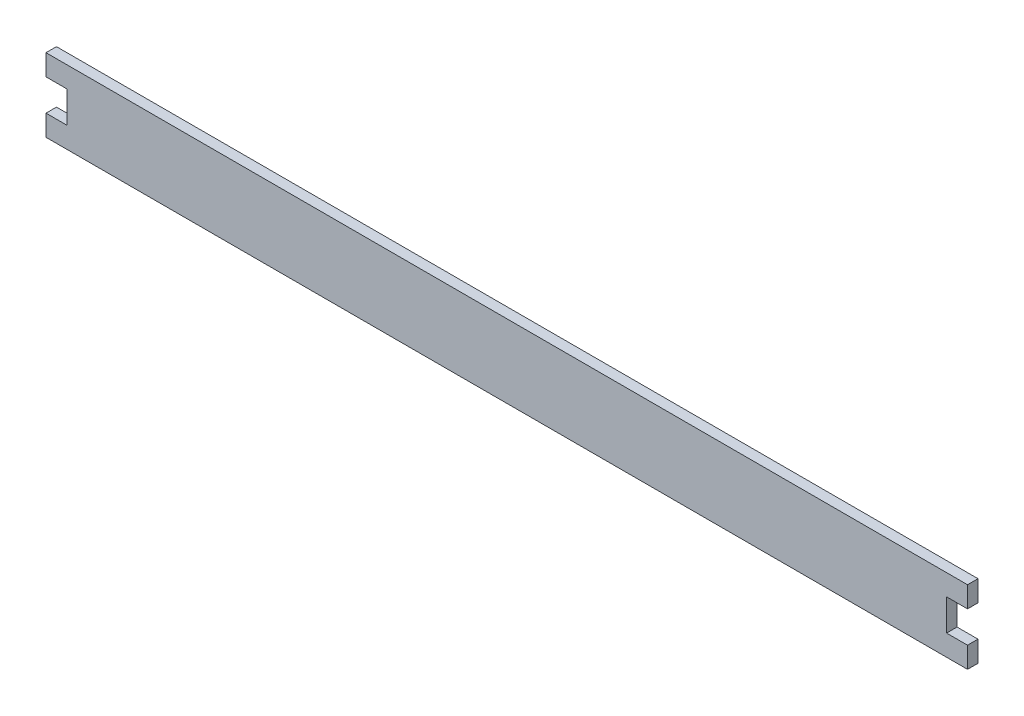
ISO-10303-21;
HEADER;
FILE_DESCRIPTION(('STEP AP214'),'2;1');
FILE_NAME('part.step','',(''),(''),'','','');
FILE_SCHEMA(('AUTOMOTIVE_DESIGN { 1 0 10303 214 1 1 1 1 }'));
ENDSEC;
DATA;
#1=APPLICATION_CONTEXT('core data for automotive mechanical design processes');
#2=APPLICATION_PROTOCOL_DEFINITION('international standard','automotive_design',2000,#1);
#3=PRODUCT_CONTEXT('',#1,'mechanical');
#4=PRODUCT('Part','Part','',(#3));
#5=PRODUCT_RELATED_PRODUCT_CATEGORY('part','',(#4));
#6=PRODUCT_DEFINITION_FORMATION('','',#4);
#7=PRODUCT_DEFINITION_CONTEXT('part definition',#1,'design');
#8=PRODUCT_DEFINITION('design','',#6,#7);
#9=PRODUCT_DEFINITION_SHAPE('','',#8);
#10=(LENGTH_UNIT() NAMED_UNIT(*) SI_UNIT(.MILLI.,.METRE.));
#11=(NAMED_UNIT(*) PLANE_ANGLE_UNIT() SI_UNIT($,.RADIAN.));
#12=(NAMED_UNIT(*) SI_UNIT($,.STERADIAN.) SOLID_ANGLE_UNIT());
#13=UNCERTAINTY_MEASURE_WITH_UNIT(LENGTH_MEASURE(1.E-05),#10,'distance_accuracy_value','');
#14=(GEOMETRIC_REPRESENTATION_CONTEXT(3) GLOBAL_UNCERTAINTY_ASSIGNED_CONTEXT((#13)) GLOBAL_UNIT_ASSIGNED_CONTEXT((#10,
#11,#12)) REPRESENTATION_CONTEXT('',''));
#15=CARTESIAN_POINT('',(0.,0.,0.));
#16=DIRECTION('',(0.,0.,1.));
#17=DIRECTION('',(1.,0.,0.));
#18=AXIS2_PLACEMENT_3D('',#15,#16,#17);
#19=CARTESIAN_POINT('',(0.,-208.363695942086,-5.));
#20=DIRECTION('',(0.,-1.,0.));
#21=DIRECTION('',(0.,0.,-1.));
#22=AXIS2_PLACEMENT_3D('',#19,#20,#21);
#23=PLANE('',#22);
#24=DIRECTION('',(1.,0.,0.));
#25=VECTOR('',#24,1.);
#26=CARTESIAN_POINT('',(0.,-208.363695942086,0.));
#27=LINE('',#26,#25);
#28=CARTESIAN_POINT('',(-1.54380092148459,-208.363695942086,0.));
#29=VERTEX_POINT('',#28);
#30=CARTESIAN_POINT('',(438.456199078514,-208.363695942086,0.));
#31=VERTEX_POINT('',#30);
#32=EDGE_CURVE('E159',#29,#31,#27,.T.);
#33=ORIENTED_EDGE('',*,*,#32,.T.);
#34=DIRECTION('',(0.,0.,1.));
#35=VECTOR('',#34,1.);
#36=CARTESIAN_POINT('',(438.456199078514,-208.363695942086,-5.));
#37=LINE('',#36,#35);
#38=CARTESIAN_POINT('',(438.456199078514,-208.363695942086,-5.));
#39=VERTEX_POINT('',#38);
#40=EDGE_CURVE('E11',#39,#31,#37,.T.);
#41=ORIENTED_EDGE('',*,*,#40,.F.);
#42=DIRECTION('',(1.,0.,0.));
#43=VECTOR('',#42,1.);
#44=CARTESIAN_POINT('',(0.,-208.363695942086,-5.));
#45=LINE('',#44,#43);
#46=CARTESIAN_POINT('',(-1.54380092148459,-208.363695942086,-5.));
#47=VERTEX_POINT('',#46);
#48=EDGE_CURVE('E189',#47,#39,#45,.T.);
#49=ORIENTED_EDGE('',*,*,#48,.F.);
#50=DIRECTION('',(0.,0.,1.));
#51=VECTOR('',#50,1.);
#52=CARTESIAN_POINT('',(-1.54380092148459,-208.363695942086,-5.));
#53=LINE('',#52,#51);
#54=EDGE_CURVE('E42',#47,#29,#53,.T.);
#55=ORIENTED_EDGE('',*,*,#54,.T.);
#56=EDGE_LOOP('',(#33,#41,#49,#55));
#57=FACE_BOUND('',#56,.T.);
#58=ADVANCED_FACE('F39',(#57),#23,.F.);
#59=CARTESIAN_POINT('',(438.456199078455,1.24129962714166E-10,-5.));
#60=DIRECTION('',(-1.,-2.83106871279415E-13,0.));
#61=DIRECTION('',(2.83106871279415E-13,-1.,0.));
#62=AXIS2_PLACEMENT_3D('',#59,#60,#61);
#63=PLANE('',#62);
#64=DIRECTION('',(2.83106871279415E-13,-1.,0.));
#65=VECTOR('',#64,1.);
#66=CARTESIAN_POINT('',(438.456199078455,1.24129962714166E-10,0.));
#67=LINE('',#66,#65);
#68=CARTESIAN_POINT('',(438.456199078517,-218.363695942086,0.));
#69=VERTEX_POINT('',#68);
#70=EDGE_CURVE('E102',#31,#69,#67,.T.);
#71=ORIENTED_EDGE('',*,*,#70,.T.);
#72=DIRECTION('',(0.,0.,1.));
#73=VECTOR('',#72,1.);
#74=CARTESIAN_POINT('',(438.456199078517,-218.363695942086,-5.));
#75=LINE('',#74,#73);
#76=CARTESIAN_POINT('',(438.456199078517,-218.363695942086,-5.));
#77=VERTEX_POINT('',#76);
#78=EDGE_CURVE('E48',#77,#69,#75,.T.);
#79=ORIENTED_EDGE('',*,*,#78,.F.);
#80=DIRECTION('',(2.83106871279415E-13,-1.,0.));
#81=VECTOR('',#80,1.);
#82=CARTESIAN_POINT('',(438.456199078455,1.24129962714166E-10,-5.));
#83=LINE('',#82,#81);
#84=EDGE_CURVE('E56',#39,#77,#83,.T.);
#85=ORIENTED_EDGE('',*,*,#84,.F.);
#86=ORIENTED_EDGE('',*,*,#40,.T.);
#87=EDGE_LOOP('',(#71,#79,#85,#86));
#88=FACE_BOUND('',#87,.T.);
#89=ADVANCED_FACE('F223',(#88),#63,.F.);
#90=CARTESIAN_POINT('',(0.,-218.363695942086,-5.));
#91=DIRECTION('',(0.,-1.,0.));
#92=DIRECTION('',(0.,0.,-1.));
#93=AXIS2_PLACEMENT_3D('',#90,#91,#92);
#94=PLANE('',#93);
#95=DIRECTION('',(1.,0.,0.));
#96=VECTOR('',#95,1.);
#97=CARTESIAN_POINT('',(0.,-218.363695942086,0.));
#98=LINE('',#97,#96);
#99=CARTESIAN_POINT('',(428.456199078516,-218.363695942086,0.));
#100=VERTEX_POINT('',#99);
#101=EDGE_CURVE('E138',#100,#69,#98,.T.);
#102=ORIENTED_EDGE('',*,*,#101,.F.);
#103=DIRECTION('',(0.,0.,1.));
#104=VECTOR('',#103,1.);
#105=CARTESIAN_POINT('',(428.456199078516,-218.363695942086,-5.));
#106=LINE('',#105,#104);
#107=CARTESIAN_POINT('',(428.456199078516,-218.363695942086,-5.));
#108=VERTEX_POINT('',#107);
#109=EDGE_CURVE('E134',#108,#100,#106,.T.);
#110=ORIENTED_EDGE('',*,*,#109,.F.);
#111=DIRECTION('',(1.,0.,0.));
#112=VECTOR('',#111,1.);
#113=CARTESIAN_POINT('',(0.,-218.363695942086,-5.));
#114=LINE('',#113,#112);
#115=EDGE_CURVE('E137',#108,#77,#114,.T.);
#116=ORIENTED_EDGE('',*,*,#115,.T.);
#117=ORIENTED_EDGE('',*,*,#78,.T.);
#118=EDGE_LOOP('',(#102,#110,#116,#117));
#119=FACE_BOUND('',#118,.T.);
#120=ADVANCED_FACE('F136',(#119),#94,.T.);
#121=CARTESIAN_POINT('',(428.456199078516,0.,-5.));
#122=DIRECTION('',(1.,0.,0.));
#123=DIRECTION('',(0.,0.,-1.));
#124=AXIS2_PLACEMENT_3D('',#121,#122,#123);
#125=PLANE('',#124);
#126=DIRECTION('',(0.,1.,0.));
#127=VECTOR('',#126,1.);
#128=CARTESIAN_POINT('',(428.456199078516,0.,0.));
#129=LINE('',#128,#127);
#130=CARTESIAN_POINT('',(428.456199078516,-233.363695942086,0.));
#131=VERTEX_POINT('',#130);
#132=EDGE_CURVE('E186',#131,#100,#129,.T.);
#133=ORIENTED_EDGE('',*,*,#132,.F.);
#134=DIRECTION('',(0.,0.,1.));
#135=VECTOR('',#134,1.);
#136=CARTESIAN_POINT('',(428.456199078516,-233.363695942086,-5.));
#137=LINE('',#136,#135);
#138=CARTESIAN_POINT('',(428.456199078516,-233.363695942086,-5.));
#139=VERTEX_POINT('',#138);
#140=EDGE_CURVE('E143',#139,#131,#137,.T.);
#141=ORIENTED_EDGE('',*,*,#140,.F.);
#142=DIRECTION('',(0.,1.,0.));
#143=VECTOR('',#142,1.);
#144=CARTESIAN_POINT('',(428.456199078516,0.,-5.));
#145=LINE('',#144,#143);
#146=EDGE_CURVE('E148',#139,#108,#145,.T.);
#147=ORIENTED_EDGE('',*,*,#146,.T.);
#148=ORIENTED_EDGE('',*,*,#109,.T.);
#149=EDGE_LOOP('',(#133,#141,#147,#148));
#150=FACE_BOUND('',#149,.T.);
#151=ADVANCED_FACE('F150',(#150),#125,.T.);
#152=CARTESIAN_POINT('',(0.,-233.363695942086,-5.));
#153=DIRECTION('',(0.,-1.,0.));
#154=DIRECTION('',(0.,0.,-1.));
#155=AXIS2_PLACEMENT_3D('',#152,#153,#154);
#156=PLANE('',#155);
#157=DIRECTION('',(1.,0.,0.));
#158=VECTOR('',#157,1.);
#159=CARTESIAN_POINT('',(0.,-233.363695942086,0.));
#160=LINE('',#159,#158);
#161=CARTESIAN_POINT('',(438.456199078517,-233.363695942086,0.));
#162=VERTEX_POINT('',#161);
#163=EDGE_CURVE('E183',#131,#162,#160,.T.);
#164=ORIENTED_EDGE('',*,*,#163,.T.);
#165=DIRECTION('',(0.,0.,1.));
#166=VECTOR('',#165,1.);
#167=CARTESIAN_POINT('',(438.456199078517,-233.363695942086,-5.));
#168=LINE('',#167,#166);
#169=CARTESIAN_POINT('',(438.456199078517,-233.363695942086,-5.));
#170=VERTEX_POINT('',#169);
#171=EDGE_CURVE('E193',#170,#162,#168,.T.);
#172=ORIENTED_EDGE('',*,*,#171,.F.);
#173=DIRECTION('',(1.,0.,0.));
#174=VECTOR('',#173,1.);
#175=CARTESIAN_POINT('',(0.,-233.363695942086,-5.));
#176=LINE('',#175,#174);
#177=EDGE_CURVE('E152',#139,#170,#176,.T.);
#178=ORIENTED_EDGE('',*,*,#177,.F.);
#179=ORIENTED_EDGE('',*,*,#140,.T.);
#180=EDGE_LOOP('',(#164,#172,#178,#179));
#181=FACE_BOUND('',#180,.T.);
#182=ADVANCED_FACE('F236',(#181),#156,.F.);
#183=CARTESIAN_POINT('',(438.456199078584,-1.26563883551736E-10,-5.));
#184=DIRECTION('',(1.,-2.88657986402541E-13,0.));
#185=DIRECTION('',(2.88657986402541E-13,1.,0.));
#186=AXIS2_PLACEMENT_3D('',#183,#184,#185);
#187=PLANE('',#186);
#188=DIRECTION('',(2.88657986402541E-13,1.,0.));
#189=VECTOR('',#188,1.);
#190=CARTESIAN_POINT('',(438.456199078584,-1.26563883551736E-10,0.));
#191=LINE('',#190,#189);
#192=CARTESIAN_POINT('',(438.456199078514,-243.363695942086,0.));
#193=VERTEX_POINT('',#192);
#194=EDGE_CURVE('E180',#193,#162,#191,.T.);
#195=ORIENTED_EDGE('',*,*,#194,.F.);
#196=DIRECTION('',(0.,0.,1.));
#197=VECTOR('',#196,1.);
#198=CARTESIAN_POINT('',(438.456199078514,-243.363695942086,-5.));
#199=LINE('',#198,#197);
#200=CARTESIAN_POINT('',(438.456199078514,-243.363695942086,-5.));
#201=VERTEX_POINT('',#200);
#202=EDGE_CURVE('E195',#201,#193,#199,.T.);
#203=ORIENTED_EDGE('',*,*,#202,.F.);
#204=DIRECTION('',(2.88657986402541E-13,1.,0.));
#205=VECTOR('',#204,1.);
#206=CARTESIAN_POINT('',(438.456199078584,-1.26563883551736E-10,-5.));
#207=LINE('',#206,#205);
#208=EDGE_CURVE('E154',#201,#170,#207,.T.);
#209=ORIENTED_EDGE('',*,*,#208,.T.);
#210=ORIENTED_EDGE('',*,*,#171,.T.);
#211=EDGE_LOOP('',(#195,#203,#209,#210));
#212=FACE_BOUND('',#211,.T.);
#213=ADVANCED_FACE('F239',(#212),#187,.T.);
#214=CARTESIAN_POINT('',(0.,-243.363695942086,-5.));
#215=DIRECTION('',(0.,-1.,0.));
#216=DIRECTION('',(0.,0.,-1.));
#217=AXIS2_PLACEMENT_3D('',#214,#215,#216);
#218=PLANE('',#217);
#219=DIRECTION('',(1.,0.,0.));
#220=VECTOR('',#219,1.);
#221=CARTESIAN_POINT('',(0.,-243.363695942086,0.));
#222=LINE('',#221,#220);
#223=CARTESIAN_POINT('',(-1.54380092148459,-243.363695942086,0.));
#224=VERTEX_POINT('',#223);
#225=EDGE_CURVE('E177',#224,#193,#222,.T.);
#226=ORIENTED_EDGE('',*,*,#225,.F.);
#227=DIRECTION('',(0.,0.,1.));
#228=VECTOR('',#227,1.);
#229=CARTESIAN_POINT('',(-1.54380092148459,-243.363695942086,-5.));
#230=LINE('',#229,#228);
#231=CARTESIAN_POINT('',(-1.54380092148459,-243.363695942086,-5.));
#232=VERTEX_POINT('',#231);
#233=EDGE_CURVE('E197',#232,#224,#230,.T.);
#234=ORIENTED_EDGE('',*,*,#233,.F.);
#235=DIRECTION('',(1.,0.,0.));
#236=VECTOR('',#235,1.);
#237=CARTESIAN_POINT('',(0.,-243.363695942086,-5.));
#238=LINE('',#237,#236);
#239=EDGE_CURVE('E281',#232,#201,#238,.T.);
#240=ORIENTED_EDGE('',*,*,#239,.T.);
#241=ORIENTED_EDGE('',*,*,#202,.T.);
#242=EDGE_LOOP('',(#226,#234,#240,#241));
#243=FACE_BOUND('',#242,.T.);
#244=ADVANCED_FACE('F243',(#243),#218,.T.);
#245=CARTESIAN_POINT('',(-1.54380092144407,2.5709449926371E-13,-5.));
#246=DIRECTION('',(-1.,1.66533453693773E-13,0.));
#247=DIRECTION('',(-1.66533453693773E-13,-1.,0.));
#248=AXIS2_PLACEMENT_3D('',#245,#246,#247);
#249=PLANE('',#248);
#250=DIRECTION('',(-1.66533453693773E-13,-1.,0.));
#251=VECTOR('',#250,1.);
#252=CARTESIAN_POINT('',(-1.54380092144407,2.5709449926371E-13,0.));
#253=LINE('',#252,#251);
#254=CARTESIAN_POINT('',(-1.54380092148293,-233.363695942086,0.));
#255=VERTEX_POINT('',#254);
#256=EDGE_CURVE('E174',#255,#224,#253,.T.);
#257=ORIENTED_EDGE('',*,*,#256,.F.);
#258=DIRECTION('',(0.,0.,1.));
#259=VECTOR('',#258,1.);
#260=CARTESIAN_POINT('',(-1.54380092148293,-233.363695942086,-5.));
#261=LINE('',#260,#259);
#262=CARTESIAN_POINT('',(-1.54380092148293,-233.363695942086,-5.));
#263=VERTEX_POINT('',#262);
#264=EDGE_CURVE('E199',#263,#255,#261,.T.);
#265=ORIENTED_EDGE('',*,*,#264,.F.);
#266=DIRECTION('',(-1.66533453693773E-13,-1.,0.));
#267=VECTOR('',#266,1.);
#268=CARTESIAN_POINT('',(-1.54380092144407,2.5709449926371E-13,-5.));
#269=LINE('',#268,#267);
#270=EDGE_CURVE('E275',#263,#232,#269,.T.);
#271=ORIENTED_EDGE('',*,*,#270,.T.);
#272=ORIENTED_EDGE('',*,*,#233,.T.);
#273=EDGE_LOOP('',(#257,#265,#271,#272));
#274=FACE_BOUND('',#273,.T.);
#275=ADVANCED_FACE('F247',(#274),#249,.T.);
#276=CARTESIAN_POINT('',(-6.4771437086634E-13,-233.363695942086,-5.));
#277=DIRECTION('',(0.,-1.,0.));
#278=DIRECTION('',(1.,0.,0.));
#279=AXIS2_PLACEMENT_3D('',#276,#277,#278);
#280=PLANE('',#279);
#281=DIRECTION('',(1.,0.,0.));
#282=VECTOR('',#281,1.);
#283=CARTESIAN_POINT('',(-6.4771437086634E-13,-233.363695942086,0.));
#284=LINE('',#283,#282);
#285=CARTESIAN_POINT('',(8.45619907851675,-233.363695942086,0.));
#286=VERTEX_POINT('',#285);
#287=EDGE_CURVE('E171',#255,#286,#284,.T.);
#288=ORIENTED_EDGE('',*,*,#287,.T.);
#289=DIRECTION('',(0.,0.,1.));
#290=VECTOR('',#289,1.);
#291=CARTESIAN_POINT('',(8.45619907851675,-233.363695942086,-5.));
#292=LINE('',#291,#290);
#293=CARTESIAN_POINT('',(8.45619907851675,-233.363695942086,-5.));
#294=VERTEX_POINT('',#293);
#295=EDGE_CURVE('E201',#294,#286,#292,.T.);
#296=ORIENTED_EDGE('',*,*,#295,.F.);
#297=DIRECTION('',(1.,0.,0.));
#298=VECTOR('',#297,1.);
#299=CARTESIAN_POINT('',(-6.4771437086634E-13,-233.363695942086,-5.));
#300=LINE('',#299,#298);
#301=EDGE_CURVE('E273',#263,#294,#300,.T.);
#302=ORIENTED_EDGE('',*,*,#301,.F.);
#303=ORIENTED_EDGE('',*,*,#264,.T.);
#304=EDGE_LOOP('',(#288,#296,#302,#303));
#305=FACE_BOUND('',#304,.T.);
#306=ADVANCED_FACE('F251',(#305),#280,.F.);
#307=CARTESIAN_POINT('',(8.45619907851661,0.,-5.));
#308=DIRECTION('',(-1.,0.,0.));
#309=DIRECTION('',(0.,-1.,0.));
#310=AXIS2_PLACEMENT_3D('',#307,#308,#309);
#311=PLANE('',#310);
#312=DIRECTION('',(0.,-1.,0.));
#313=VECTOR('',#312,1.);
#314=CARTESIAN_POINT('',(8.45619907851661,0.,0.));
#315=LINE('',#314,#313);
#316=CARTESIAN_POINT('',(8.45619907851674,-218.363695942086,0.));
#317=VERTEX_POINT('',#316);
#318=EDGE_CURVE('E168',#317,#286,#315,.T.);
#319=ORIENTED_EDGE('',*,*,#318,.F.);
#320=DIRECTION('',(0.,0.,1.));
#321=VECTOR('',#320,1.);
#322=CARTESIAN_POINT('',(8.45619907851674,-218.363695942086,-5.));
#323=LINE('',#322,#321);
#324=CARTESIAN_POINT('',(8.45619907851674,-218.363695942086,-5.));
#325=VERTEX_POINT('',#324);
#326=EDGE_CURVE('E203',#325,#317,#323,.T.);
#327=ORIENTED_EDGE('',*,*,#326,.F.);
#328=DIRECTION('',(0.,-1.,0.));
#329=VECTOR('',#328,1.);
#330=CARTESIAN_POINT('',(8.45619907851661,0.,-5.));
#331=LINE('',#330,#329);
#332=EDGE_CURVE('E268',#325,#294,#331,.T.);
#333=ORIENTED_EDGE('',*,*,#332,.T.);
#334=ORIENTED_EDGE('',*,*,#295,.T.);
#335=EDGE_LOOP('',(#319,#327,#333,#334));
#336=FACE_BOUND('',#335,.T.);
#337=ADVANCED_FACE('F219',(#336),#311,.T.);
#338=CARTESIAN_POINT('',(6.06081007442876E-13,-218.363695942086,-5.));
#339=DIRECTION('',(0.,1.,0.));
#340=DIRECTION('',(-1.,0.,0.));
#341=AXIS2_PLACEMENT_3D('',#338,#339,#340);
#342=PLANE('',#341);
#343=DIRECTION('',(-1.,0.,0.));
#344=VECTOR('',#343,1.);
#345=CARTESIAN_POINT('',(6.06081007442876E-13,-218.363695942086,0.));
#346=LINE('',#345,#344);
#347=CARTESIAN_POINT('',(-1.54380092148326,-218.363695942086,0.));
#348=VERTEX_POINT('',#347);
#349=EDGE_CURVE('E165',#317,#348,#346,.T.);
#350=ORIENTED_EDGE('',*,*,#349,.T.);
#351=DIRECTION('',(0.,0.,1.));
#352=VECTOR('',#351,1.);
#353=CARTESIAN_POINT('',(-1.54380092148326,-218.363695942086,-5.));
#354=LINE('',#353,#352);
#355=CARTESIAN_POINT('',(-1.54380092148326,-218.363695942086,-5.));
#356=VERTEX_POINT('',#355);
#357=EDGE_CURVE('E204',#356,#348,#354,.T.);
#358=ORIENTED_EDGE('',*,*,#357,.F.);
#359=DIRECTION('',(-1.,0.,0.));
#360=VECTOR('',#359,1.);
#361=CARTESIAN_POINT('',(6.06081007442876E-13,-218.363695942086,-5.));
#362=LINE('',#361,#360);
#363=EDGE_CURVE('E266',#325,#356,#362,.T.);
#364=ORIENTED_EDGE('',*,*,#363,.F.);
#365=ORIENTED_EDGE('',*,*,#326,.T.);
#366=EDGE_LOOP('',(#350,#358,#364,#365));
#367=FACE_BOUND('',#366,.T.);
#368=ADVANCED_FACE('F213',(#367),#342,.F.);
#369=CARTESIAN_POINT('',(-1.54380092151236,-2.05709075266326E-13,-5.));
#370=DIRECTION('',(-1.,-1.33248446998468E-13,0.));
#371=DIRECTION('',(1.33248446998468E-13,-1.,0.));
#372=AXIS2_PLACEMENT_3D('',#369,#370,#371);
#373=PLANE('',#372);
#374=DIRECTION('',(1.33248446998468E-13,-1.,0.));
#375=VECTOR('',#374,1.);
#376=CARTESIAN_POINT('',(-1.54380092151236,-2.05709075266326E-13,0.));
#377=LINE('',#376,#375);
#378=EDGE_CURVE('E162',#29,#348,#377,.T.);
#379=ORIENTED_EDGE('',*,*,#378,.F.);
#380=ORIENTED_EDGE('',*,*,#54,.F.);
#381=DIRECTION('',(1.33248446998468E-13,-1.,0.));
#382=VECTOR('',#381,1.);
#383=CARTESIAN_POINT('',(-1.54380092151236,-2.05709075266326E-13,-5.));
#384=LINE('',#383,#382);
#385=EDGE_CURVE('E269',#47,#356,#384,.T.);
#386=ORIENTED_EDGE('',*,*,#385,.T.);
#387=ORIENTED_EDGE('',*,*,#357,.T.);
#388=EDGE_LOOP('',(#379,#380,#386,#387));
#389=FACE_BOUND('',#388,.T.);
#390=ADVANCED_FACE('F211',(#389),#373,.T.);
#391=CARTESIAN_POINT('',(0.,0.,-5.));
#392=DIRECTION('',(0.,0.,1.));
#393=DIRECTION('',(1.,0.,0.));
#394=AXIS2_PLACEMENT_3D('',#391,#392,#393);
#395=PLANE('',#394);
#396=ORIENTED_EDGE('',*,*,#48,.T.);
#397=ORIENTED_EDGE('',*,*,#84,.T.);
#398=ORIENTED_EDGE('',*,*,#115,.F.);
#399=ORIENTED_EDGE('',*,*,#146,.F.);
#400=ORIENTED_EDGE('',*,*,#177,.T.);
#401=ORIENTED_EDGE('',*,*,#208,.F.);
#402=ORIENTED_EDGE('',*,*,#239,.F.);
#403=ORIENTED_EDGE('',*,*,#270,.F.);
#404=ORIENTED_EDGE('',*,*,#301,.T.);
#405=ORIENTED_EDGE('',*,*,#332,.F.);
#406=ORIENTED_EDGE('',*,*,#363,.T.);
#407=ORIENTED_EDGE('',*,*,#385,.F.);
#408=EDGE_LOOP('',(#396,#397,#398,#399,#400,#401,#402,#403,#404,#405,#406,#407));
#409=FACE_BOUND('',#408,.T.);
#410=ADVANCED_FACE('F147',(#409),#395,.F.);
#411=CARTESIAN_POINT('',(0.,0.,0.));
#412=DIRECTION('',(0.,0.,1.));
#413=DIRECTION('',(1.,0.,0.));
#414=AXIS2_PLACEMENT_3D('',#411,#412,#413);
#415=PLANE('',#414);
#416=ORIENTED_EDGE('',*,*,#32,.F.);
#417=ORIENTED_EDGE('',*,*,#378,.T.);
#418=ORIENTED_EDGE('',*,*,#349,.F.);
#419=ORIENTED_EDGE('',*,*,#318,.T.);
#420=ORIENTED_EDGE('',*,*,#287,.F.);
#421=ORIENTED_EDGE('',*,*,#256,.T.);
#422=ORIENTED_EDGE('',*,*,#225,.T.);
#423=ORIENTED_EDGE('',*,*,#194,.T.);
#424=ORIENTED_EDGE('',*,*,#163,.F.);
#425=ORIENTED_EDGE('',*,*,#132,.T.);
#426=ORIENTED_EDGE('',*,*,#101,.T.);
#427=ORIENTED_EDGE('',*,*,#70,.F.);
#428=EDGE_LOOP('',(#416,#417,#418,#419,#420,#421,#422,#423,#424,#425,#426,#427));
#429=FACE_BOUND('',#428,.T.);
#430=ADVANCED_FACE('F209',(#429),#415,.T.);
#431=CLOSED_SHELL('',(#58,#89,#120,#151,#182,#213,#244,#275,#306,#337,#368,#390,#410,#430));
#432=MANIFOLD_SOLID_BREP('B2',#431);
#433=ADVANCED_BREP_SHAPE_REPRESENTATION('',(#18,#432),#14);
#434=SHAPE_DEFINITION_REPRESENTATION(#9,#433);
ENDSEC;
END-ISO-10303-21;
